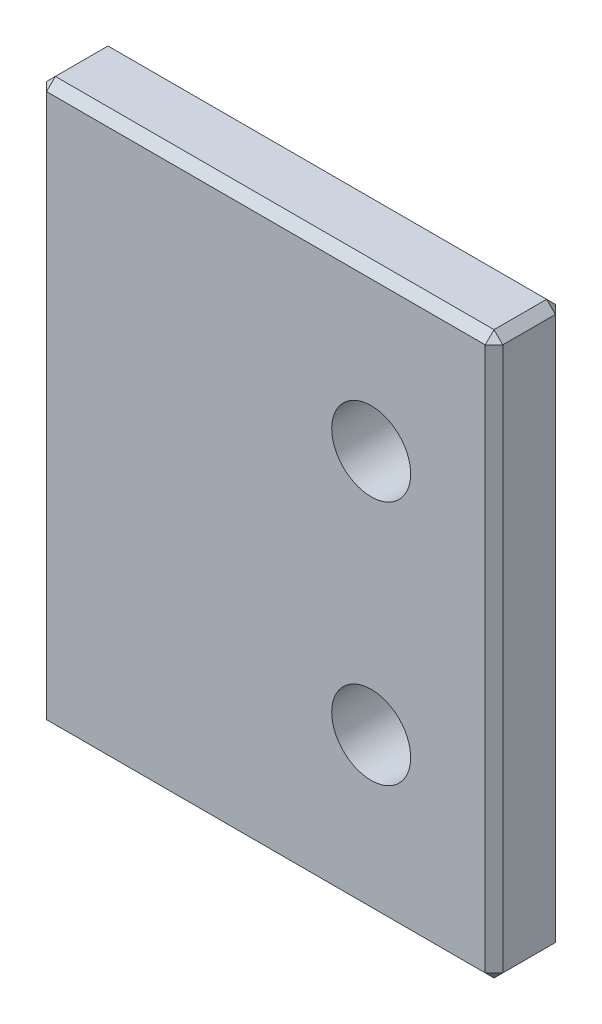
ISO-10303-21;
HEADER;
FILE_DESCRIPTION(('STEP AP214'),'2;1');
FILE_NAME('part.step','',(''),(''),'','','');
FILE_SCHEMA(('AUTOMOTIVE_DESIGN { 1 0 10303 214 1 1 1 1 }'));
ENDSEC;
DATA;
#1=APPLICATION_CONTEXT('core data for automotive mechanical design processes');
#2=APPLICATION_PROTOCOL_DEFINITION('international standard','automotive_design',2000,#1);
#3=PRODUCT_CONTEXT('',#1,'mechanical');
#4=PRODUCT('Part','Part','',(#3));
#5=PRODUCT_RELATED_PRODUCT_CATEGORY('part','',(#4));
#6=PRODUCT_DEFINITION_FORMATION('','',#4);
#7=PRODUCT_DEFINITION_CONTEXT('part definition',#1,'design');
#8=PRODUCT_DEFINITION('design','',#6,#7);
#9=PRODUCT_DEFINITION_SHAPE('','',#8);
#10=(LENGTH_UNIT() NAMED_UNIT(*) SI_UNIT(.MILLI.,.METRE.));
#11=(NAMED_UNIT(*) PLANE_ANGLE_UNIT() SI_UNIT($,.RADIAN.));
#12=(NAMED_UNIT(*) SI_UNIT($,.STERADIAN.) SOLID_ANGLE_UNIT());
#13=UNCERTAINTY_MEASURE_WITH_UNIT(LENGTH_MEASURE(1.E-05),#10,'distance_accuracy_value','');
#14=(GEOMETRIC_REPRESENTATION_CONTEXT(3) GLOBAL_UNCERTAINTY_ASSIGNED_CONTEXT((#13)) GLOBAL_UNIT_ASSIGNED_CONTEXT((#10,
#11,#12)) REPRESENTATION_CONTEXT('',''));
#15=CARTESIAN_POINT('',(0.,0.,0.));
#16=DIRECTION('',(0.,0.,1.));
#17=DIRECTION('',(1.,0.,0.));
#18=AXIS2_PLACEMENT_3D('',#15,#16,#17);
#19=CARTESIAN_POINT('',(0.,0.,4.));
#20=DIRECTION('',(1.,0.,0.));
#21=DIRECTION('',(0.,1.,0.));
#22=AXIS2_PLACEMENT_3D('',#19,#20,#21);
#23=PLANE('',#22);
#24=DIRECTION('',(0.,-1.,0.));
#25=VECTOR('',#24,1.);
#26=CARTESIAN_POINT('',(0.,0.,0.499999999999997));
#27=LINE('',#26,#25);
#28=CARTESIAN_POINT('',(0.,31.5,0.499999999999997));
#29=VERTEX_POINT('',#28);
#30=CARTESIAN_POINT('',(0.,0.5,0.499999999999997));
#31=VERTEX_POINT('',#30);
#32=EDGE_CURVE('E171',#29,#31,#27,.T.);
#33=ORIENTED_EDGE('',*,*,#32,.T.);
#34=DIRECTION('',(0.,0.,1.));
#35=VECTOR('',#34,1.);
#36=CARTESIAN_POINT('',(0.,0.5,4.));
#37=LINE('',#36,#35);
#38=CARTESIAN_POINT('',(0.,0.5,3.5));
#39=VERTEX_POINT('',#38);
#40=EDGE_CURVE('E176',#31,#39,#37,.T.);
#41=ORIENTED_EDGE('',*,*,#40,.T.);
#42=DIRECTION('',(0.,1.,0.));
#43=VECTOR('',#42,1.);
#44=CARTESIAN_POINT('',(0.,0.,3.5));
#45=LINE('',#44,#43);
#46=CARTESIAN_POINT('',(0.,31.5,3.5));
#47=VERTEX_POINT('',#46);
#48=EDGE_CURVE('E173',#39,#47,#45,.T.);
#49=ORIENTED_EDGE('',*,*,#48,.T.);
#50=DIRECTION('',(0.,0.,-1.));
#51=VECTOR('',#50,1.);
#52=CARTESIAN_POINT('',(0.,31.5,4.));
#53=LINE('',#52,#51);
#54=EDGE_CURVE('E169',#47,#29,#53,.T.);
#55=ORIENTED_EDGE('',*,*,#54,.T.);
#56=EDGE_LOOP('',(#33,#41,#49,#55));
#57=FACE_BOUND('',#56,.T.);
#58=ADVANCED_FACE('F36',(#57),#23,.F.);
#59=CARTESIAN_POINT('',(0.,0.,4.));
#60=DIRECTION('',(0.,1.,0.));
#61=DIRECTION('',(0.,0.,1.));
#62=AXIS2_PLACEMENT_3D('',#59,#60,#61);
#63=PLANE('',#62);
#64=DIRECTION('',(-1.,0.,0.));
#65=VECTOR('',#64,1.);
#66=CARTESIAN_POINT('',(0.,0.,3.5));
#67=LINE('',#66,#65);
#68=CARTESIAN_POINT('',(25.5,0.,3.5));
#69=VERTEX_POINT('',#68);
#70=CARTESIAN_POINT('',(0.499999999999997,0.,3.5));
#71=VERTEX_POINT('',#70);
#72=EDGE_CURVE('E191',#69,#71,#67,.T.);
#73=ORIENTED_EDGE('',*,*,#72,.T.);
#74=DIRECTION('',(0.,0.,-1.));
#75=VECTOR('',#74,1.);
#76=CARTESIAN_POINT('',(0.499999999999997,0.,4.));
#77=LINE('',#76,#75);
#78=CARTESIAN_POINT('',(0.499999999999997,0.,0.499999999999997));
#79=VERTEX_POINT('',#78);
#80=EDGE_CURVE('E193',#71,#79,#77,.T.);
#81=ORIENTED_EDGE('',*,*,#80,.T.);
#82=DIRECTION('',(1.,0.,0.));
#83=VECTOR('',#82,1.);
#84=CARTESIAN_POINT('',(26.,0.,0.499999999999997));
#85=LINE('',#84,#83);
#86=CARTESIAN_POINT('',(25.5,0.,0.499999999999997));
#87=VERTEX_POINT('',#86);
#88=EDGE_CURVE('E189',#79,#87,#85,.T.);
#89=ORIENTED_EDGE('',*,*,#88,.T.);
#90=DIRECTION('',(0.,0.,1.));
#91=VECTOR('',#90,1.);
#92=CARTESIAN_POINT('',(25.5,0.,4.));
#93=LINE('',#92,#91);
#94=EDGE_CURVE('E187',#87,#69,#93,.T.);
#95=ORIENTED_EDGE('',*,*,#94,.T.);
#96=EDGE_LOOP('',(#73,#81,#89,#95));
#97=FACE_BOUND('',#96,.T.);
#98=ADVANCED_FACE('F283',(#97),#63,.F.);
#99=CARTESIAN_POINT('',(26.,0.,4.));
#100=DIRECTION('',(-1.,0.,0.));
#101=DIRECTION('',(0.,-1.,0.));
#102=AXIS2_PLACEMENT_3D('',#99,#100,#101);
#103=PLANE('',#102);
#104=DIRECTION('',(0.,-1.,0.));
#105=VECTOR('',#104,1.);
#106=CARTESIAN_POINT('',(26.,0.,3.5));
#107=LINE('',#106,#105);
#108=CARTESIAN_POINT('',(26.,31.5,3.5));
#109=VERTEX_POINT('',#108);
#110=CARTESIAN_POINT('',(26.,0.499999999999997,3.5));
#111=VERTEX_POINT('',#110);
#112=EDGE_CURVE('E141',#109,#111,#107,.T.);
#113=ORIENTED_EDGE('',*,*,#112,.T.);
#114=DIRECTION('',(0.,0.,-1.));
#115=VECTOR('',#114,1.);
#116=CARTESIAN_POINT('',(26.,0.499999999999997,4.));
#117=LINE('',#116,#115);
#118=CARTESIAN_POINT('',(26.,0.499999999999997,0.499999999999997));
#119=VERTEX_POINT('',#118);
#120=EDGE_CURVE('E201',#111,#119,#117,.T.);
#121=ORIENTED_EDGE('',*,*,#120,.T.);
#122=DIRECTION('',(0.,1.,0.));
#123=VECTOR('',#122,1.);
#124=CARTESIAN_POINT('',(26.,32.,0.499999999999997));
#125=LINE('',#124,#123);
#126=CARTESIAN_POINT('',(26.,31.5,0.499999999999997));
#127=VERTEX_POINT('',#126);
#128=EDGE_CURVE('E198',#119,#127,#125,.T.);
#129=ORIENTED_EDGE('',*,*,#128,.T.);
#130=DIRECTION('',(0.,0.,1.));
#131=VECTOR('',#130,1.);
#132=CARTESIAN_POINT('',(26.,31.5,4.));
#133=LINE('',#132,#131);
#134=EDGE_CURVE('E196',#127,#109,#133,.T.);
#135=ORIENTED_EDGE('',*,*,#134,.T.);
#136=EDGE_LOOP('',(#113,#121,#129,#135));
#137=FACE_BOUND('',#136,.T.);
#138=ADVANCED_FACE('F270',(#137),#103,.F.);
#139=CARTESIAN_POINT('',(0.,32.,4.));
#140=DIRECTION('',(0.,-1.,0.));
#141=DIRECTION('',(0.,0.,-1.));
#142=AXIS2_PLACEMENT_3D('',#139,#140,#141);
#143=PLANE('',#142);
#144=DIRECTION('',(1.,0.,0.));
#145=VECTOR('',#144,1.);
#146=CARTESIAN_POINT('',(0.,32.,3.5));
#147=LINE('',#146,#145);
#148=CARTESIAN_POINT('',(0.499999999999987,32.,3.5));
#149=VERTEX_POINT('',#148);
#150=CARTESIAN_POINT('',(25.5,32.,3.5));
#151=VERTEX_POINT('',#150);
#152=EDGE_CURVE('E45',#149,#151,#147,.T.);
#153=ORIENTED_EDGE('',*,*,#152,.T.);
#154=DIRECTION('',(0.,0.,-1.));
#155=VECTOR('',#154,1.);
#156=CARTESIAN_POINT('',(25.5,32.,4.));
#157=LINE('',#156,#155);
#158=CARTESIAN_POINT('',(25.5,32.,0.499999999999997));
#159=VERTEX_POINT('',#158);
#160=EDGE_CURVE('E11',#151,#159,#157,.T.);
#161=ORIENTED_EDGE('',*,*,#160,.T.);
#162=DIRECTION('',(-1.,0.,0.));
#163=VECTOR('',#162,1.);
#164=CARTESIAN_POINT('',(0.,32.,0.499999999999997));
#165=LINE('',#164,#163);
#166=CARTESIAN_POINT('',(0.499999999999987,32.,0.499999999999997));
#167=VERTEX_POINT('',#166);
#168=EDGE_CURVE('E204',#159,#167,#165,.T.);
#169=ORIENTED_EDGE('',*,*,#168,.T.);
#170=DIRECTION('',(0.,0.,1.));
#171=VECTOR('',#170,1.);
#172=CARTESIAN_POINT('',(0.499999999999987,32.,4.));
#173=LINE('',#172,#171);
#174=EDGE_CURVE('E56',#167,#149,#173,.T.);
#175=ORIENTED_EDGE('',*,*,#174,.T.);
#176=EDGE_LOOP('',(#153,#161,#169,#175));
#177=FACE_BOUND('',#176,.T.);
#178=ADVANCED_FACE('F316',(#177),#143,.F.);
#179=CARTESIAN_POINT('',(0.,32.,4.));
#180=DIRECTION('',(0.,0.,-1.));
#181=DIRECTION('',(-1.,0.,0.));
#182=AXIS2_PLACEMENT_3D('',#179,#180,#181);
#183=PLANE('',#182);
#184=CARTESIAN_POINT('',(19.,23.0000000000001,4.));
#185=DIRECTION('',(0.,0.,-1.));
#186=DIRECTION('',(-1.,0.,0.));
#187=AXIS2_PLACEMENT_3D('',#184,#185,#186);
#188=CIRCLE('',#187,2.25000000000012);
#189=CARTESIAN_POINT('',(16.7499999999998,23.0000000000001,4.));
#190=VERTEX_POINT('',#189);
#191=EDGE_CURVE('E404',#190,#190,#188,.T.);
#192=ORIENTED_EDGE('',*,*,#191,.T.);
#193=EDGE_LOOP('',(#192));
#194=FACE_BOUND('',#193,.T.);
#195=CARTESIAN_POINT('',(19.,9.0000000000001,4.));
#196=DIRECTION('',(0.,0.,-1.));
#197=DIRECTION('',(-1.,0.,0.));
#198=AXIS2_PLACEMENT_3D('',#195,#196,#197);
#199=CIRCLE('',#198,2.25000000000011);
#200=CARTESIAN_POINT('',(16.7499999999998,9.0000000000001,4.));
#201=VERTEX_POINT('',#200);
#202=EDGE_CURVE('E211',#201,#201,#199,.T.);
#203=ORIENTED_EDGE('',*,*,#202,.T.);
#204=EDGE_LOOP('',(#203));
#205=FACE_BOUND('',#204,.T.);
#206=DIRECTION('',(-1.,0.,0.));
#207=VECTOR('',#206,1.);
#208=CARTESIAN_POINT('',(0.,31.5,4.));
#209=LINE('',#208,#207);
#210=CARTESIAN_POINT('',(25.5,31.5,4.));
#211=VERTEX_POINT('',#210);
#212=CARTESIAN_POINT('',(0.499999999999987,31.5,4.));
#213=VERTEX_POINT('',#212);
#214=EDGE_CURVE('E128',#211,#213,#209,.T.);
#215=ORIENTED_EDGE('',*,*,#214,.T.);
#216=DIRECTION('',(0.,-1.,0.));
#217=VECTOR('',#216,1.);
#218=CARTESIAN_POINT('',(0.499999999999987,32.,4.));
#219=LINE('',#218,#217);
#220=CARTESIAN_POINT('',(0.499999999999997,0.5,4.));
#221=VERTEX_POINT('',#220);
#222=EDGE_CURVE('E167',#213,#221,#219,.T.);
#223=ORIENTED_EDGE('',*,*,#222,.T.);
#224=DIRECTION('',(1.,0.,0.));
#225=VECTOR('',#224,1.);
#226=CARTESIAN_POINT('',(0.,0.5,4.));
#227=LINE('',#226,#225);
#228=CARTESIAN_POINT('',(25.5,0.5,4.));
#229=VERTEX_POINT('',#228);
#230=EDGE_CURVE('E131',#221,#229,#227,.T.);
#231=ORIENTED_EDGE('',*,*,#230,.T.);
#232=DIRECTION('',(0.,1.,0.));
#233=VECTOR('',#232,1.);
#234=CARTESIAN_POINT('',(25.5,32.,4.));
#235=LINE('',#234,#233);
#236=EDGE_CURVE('E123',#229,#211,#235,.T.);
#237=ORIENTED_EDGE('',*,*,#236,.T.);
#238=EDGE_LOOP('',(#215,#223,#231,#237));
#239=FACE_BOUND('',#238,.T.);
#240=ADVANCED_FACE('F125',(#194,#205,#239),#183,.F.);
#241=CARTESIAN_POINT('',(0.,32.,0.));
#242=DIRECTION('',(0.,0.,-1.));
#243=DIRECTION('',(-1.,0.,0.));
#244=AXIS2_PLACEMENT_3D('',#241,#242,#243);
#245=PLANE('',#244);
#246=CARTESIAN_POINT('',(19.,23.0000000000001,0.));
#247=DIRECTION('',(0.,0.,-1.));
#248=DIRECTION('',(-1.,0.,0.));
#249=AXIS2_PLACEMENT_3D('',#246,#247,#248);
#250=CIRCLE('',#249,2.25000000000012);
#251=CARTESIAN_POINT('',(16.7499999999998,23.0000000000001,0.));
#252=VERTEX_POINT('',#251);
#253=EDGE_CURVE('E406',#252,#252,#250,.T.);
#254=ORIENTED_EDGE('',*,*,#253,.F.);
#255=EDGE_LOOP('',(#254));
#256=FACE_BOUND('',#255,.T.);
#257=CARTESIAN_POINT('',(19.,9.0000000000001,0.));
#258=DIRECTION('',(0.,0.,-1.));
#259=DIRECTION('',(-1.,0.,0.));
#260=AXIS2_PLACEMENT_3D('',#257,#258,#259);
#261=CIRCLE('',#260,2.25000000000011);
#262=CARTESIAN_POINT('',(16.7499999999998,9.0000000000001,0.));
#263=VERTEX_POINT('',#262);
#264=EDGE_CURVE('E163',#263,#263,#261,.T.);
#265=ORIENTED_EDGE('',*,*,#264,.F.);
#266=EDGE_LOOP('',(#265));
#267=FACE_BOUND('',#266,.T.);
#268=DIRECTION('',(-1.,0.,0.));
#269=VECTOR('',#268,1.);
#270=CARTESIAN_POINT('',(0.,0.5,0.));
#271=LINE('',#270,#269);
#272=CARTESIAN_POINT('',(25.5,0.5,0.));
#273=VERTEX_POINT('',#272);
#274=CARTESIAN_POINT('',(0.5,0.5,0.));
#275=VERTEX_POINT('',#274);
#276=EDGE_CURVE('E182',#273,#275,#271,.T.);
#277=ORIENTED_EDGE('',*,*,#276,.T.);
#278=DIRECTION('',(0.,1.,0.));
#279=VECTOR('',#278,1.);
#280=CARTESIAN_POINT('',(0.49999999999999,32.,0.));
#281=LINE('',#280,#279);
#282=CARTESIAN_POINT('',(0.49999999999999,31.5,0.));
#283=VERTEX_POINT('',#282);
#284=EDGE_CURVE('E184',#275,#283,#281,.T.);
#285=ORIENTED_EDGE('',*,*,#284,.T.);
#286=DIRECTION('',(1.,0.,0.));
#287=VECTOR('',#286,1.);
#288=CARTESIAN_POINT('',(26.,31.5,0.));
#289=LINE('',#288,#287);
#290=CARTESIAN_POINT('',(25.5,31.5,0.));
#291=VERTEX_POINT('',#290);
#292=EDGE_CURVE('E178',#283,#291,#289,.T.);
#293=ORIENTED_EDGE('',*,*,#292,.T.);
#294=DIRECTION('',(0.,-1.,0.));
#295=VECTOR('',#294,1.);
#296=CARTESIAN_POINT('',(25.5,0.,0.));
#297=LINE('',#296,#295);
#298=EDGE_CURVE('E180',#291,#273,#297,.T.);
#299=ORIENTED_EDGE('',*,*,#298,.T.);
#300=EDGE_LOOP('',(#277,#285,#293,#299));
#301=FACE_BOUND('',#300,.T.);
#302=ADVANCED_FACE('F299',(#256,#267,#301),#245,.T.);
#303=CARTESIAN_POINT('',(26.,0.,0.499999999999997));
#304=DIRECTION('',(0.707106781186547,0.,-0.707106781186547));
#305=DIRECTION('',(-0.707106781186548,0.,-0.707106781186548));
#306=AXIS2_PLACEMENT_3D('',#303,#304,#305);
#307=PLANE('',#306);
#308=DIRECTION('',(-0.707106781186548,0.,-0.707106781186548));
#309=VECTOR('',#308,1.);
#310=CARTESIAN_POINT('',(26.,31.5,0.499999999999997));
#311=LINE('',#310,#309);
#312=EDGE_CURVE('E40',#127,#291,#311,.T.);
#313=ORIENTED_EDGE('',*,*,#312,.F.);
#314=ORIENTED_EDGE('',*,*,#128,.F.);
#315=DIRECTION('',(0.707106781186547,0.,0.707106781186547));
#316=VECTOR('',#315,1.);
#317=CARTESIAN_POINT('',(25.75,0.499999999999999,0.249999999999999));
#318=LINE('',#317,#316);
#319=EDGE_CURVE('E161',#273,#119,#318,.T.);
#320=ORIENTED_EDGE('',*,*,#319,.F.);
#321=ORIENTED_EDGE('',*,*,#298,.F.);
#322=EDGE_LOOP('',(#313,#314,#320,#321));
#323=FACE_BOUND('',#322,.T.);
#324=ADVANCED_FACE('F38',(#323),#307,.T.);
#325=CARTESIAN_POINT('',(26.,31.5,0.499999999999997));
#326=DIRECTION('',(0.577350269189627,0.577350269189623,-0.577350269189627));
#327=DIRECTION('',(-0.707106781186547,0.,-0.707106781186547));
#328=AXIS2_PLACEMENT_3D('',#325,#326,#327);
#329=PLANE('',#328);
#330=DIRECTION('',(-0.707106781186545,0.70710678118655,0.));
#331=VECTOR('',#330,1.);
#332=CARTESIAN_POINT('',(26.,31.5,0.499999999999997));
#333=LINE('',#332,#331);
#334=EDGE_CURVE('E250',#127,#159,#333,.T.);
#335=ORIENTED_EDGE('',*,*,#334,.F.);
#336=ORIENTED_EDGE('',*,*,#312,.T.);
#337=DIRECTION('',(0.,0.70710678118655,0.707106781186545));
#338=VECTOR('',#337,1.);
#339=CARTESIAN_POINT('',(25.5,31.75,0.249999999999997));
#340=LINE('',#339,#338);
#341=EDGE_CURVE('E253',#159,#291,#340,.F.);
#342=ORIENTED_EDGE('',*,*,#341,.F.);
#343=EDGE_LOOP('',(#335,#336,#342));
#344=FACE_BOUND('',#343,.T.);
#345=ADVANCED_FACE('F312',(#344),#329,.T.);
#346=CARTESIAN_POINT('',(25.5,0.,0.499999999999997));
#347=DIRECTION('',(0.577350269189623,-0.577350269189627,-0.577350269189627));
#348=DIRECTION('',(0.,0.707106781186547,-0.707106781186547));
#349=AXIS2_PLACEMENT_3D('',#346,#347,#348);
#350=PLANE('',#349);
#351=DIRECTION('',(0.,0.70710678118655,-0.707106781186545));
#352=VECTOR('',#351,1.);
#353=CARTESIAN_POINT('',(25.5,0.,0.499999999999997));
#354=LINE('',#353,#352);
#355=EDGE_CURVE('E245',#273,#87,#354,.F.);
#356=ORIENTED_EDGE('',*,*,#355,.F.);
#357=ORIENTED_EDGE('',*,*,#319,.T.);
#358=DIRECTION('',(0.70710678118655,0.707106781186545,0.));
#359=VECTOR('',#358,1.);
#360=CARTESIAN_POINT('',(25.5,0.,0.499999999999997));
#361=LINE('',#360,#359);
#362=EDGE_CURVE('E248',#87,#119,#361,.T.);
#363=ORIENTED_EDGE('',*,*,#362,.F.);
#364=EDGE_LOOP('',(#356,#357,#363));
#365=FACE_BOUND('',#364,.T.);
#366=ADVANCED_FACE('F261',(#365),#350,.T.);
#367=CARTESIAN_POINT('',(0.,32.,0.499999999999997));
#368=DIRECTION('',(0.,0.707106781186545,-0.70710678118655));
#369=DIRECTION('',(0.,0.70710678118655,0.707106781186545));
#370=AXIS2_PLACEMENT_3D('',#367,#368,#369);
#371=PLANE('',#370);
#372=ORIENTED_EDGE('',*,*,#341,.T.);
#373=ORIENTED_EDGE('',*,*,#292,.F.);
#374=DIRECTION('',(0.,-0.70710678118655,-0.707106781186545));
#375=VECTOR('',#374,1.);
#376=CARTESIAN_POINT('',(0.49999999999999,31.5,0.));
#377=LINE('',#376,#375);
#378=EDGE_CURVE('E240',#167,#283,#377,.T.);
#379=ORIENTED_EDGE('',*,*,#378,.F.);
#380=ORIENTED_EDGE('',*,*,#168,.F.);
#381=EDGE_LOOP('',(#372,#373,#379,#380));
#382=FACE_BOUND('',#381,.T.);
#383=ADVANCED_FACE('F309',(#382),#371,.T.);
#384=CARTESIAN_POINT('',(25.5,32.,4.));
#385=DIRECTION('',(-0.70710678118655,-0.707106781186545,0.));
#386=DIRECTION('',(0.707106781186545,-0.70710678118655,0.));
#387=AXIS2_PLACEMENT_3D('',#384,#385,#386);
#388=PLANE('',#387);
#389=ORIENTED_EDGE('',*,*,#334,.T.);
#390=ORIENTED_EDGE('',*,*,#160,.F.);
#391=DIRECTION('',(0.707106781186545,-0.70710678118655,0.));
#392=VECTOR('',#391,1.);
#393=CARTESIAN_POINT('',(25.75,31.75,3.5));
#394=LINE('',#393,#392);
#395=EDGE_CURVE('E145',#109,#151,#394,.F.);
#396=ORIENTED_EDGE('',*,*,#395,.F.);
#397=ORIENTED_EDGE('',*,*,#134,.F.);
#398=EDGE_LOOP('',(#389,#390,#396,#397));
#399=FACE_BOUND('',#398,.T.);
#400=ADVANCED_FACE('F315',(#399),#388,.F.);
#401=CARTESIAN_POINT('',(25.5,32.,4.));
#402=DIRECTION('',(-0.70710678118655,0.,-0.707106781186545));
#403=DIRECTION('',(-0.707106781186545,0.,0.70710678118655));
#404=AXIS2_PLACEMENT_3D('',#401,#402,#403);
#405=PLANE('',#404);
#406=DIRECTION('',(0.707106781186545,0.,-0.70710678118655));
#407=VECTOR('',#406,1.);
#408=CARTESIAN_POINT('',(25.5,0.5,4.));
#409=LINE('',#408,#407);
#410=EDGE_CURVE('E146',#111,#229,#409,.F.);
#411=ORIENTED_EDGE('',*,*,#410,.F.);
#412=ORIENTED_EDGE('',*,*,#112,.F.);
#413=DIRECTION('',(-0.707106781186545,0.,0.70710678118655));
#414=VECTOR('',#413,1.);
#415=CARTESIAN_POINT('',(25.5,31.5,4.));
#416=LINE('',#415,#414);
#417=EDGE_CURVE('E138',#211,#109,#416,.F.);
#418=ORIENTED_EDGE('',*,*,#417,.F.);
#419=ORIENTED_EDGE('',*,*,#236,.F.);
#420=EDGE_LOOP('',(#411,#412,#418,#419));
#421=FACE_BOUND('',#420,.T.);
#422=ADVANCED_FACE('F140',(#421),#405,.F.);
#423=CARTESIAN_POINT('',(26.,0.499999999999997,4.));
#424=DIRECTION('',(-0.707106781186545,0.70710678118655,0.));
#425=DIRECTION('',(-0.70710678118655,-0.707106781186545,0.));
#426=AXIS2_PLACEMENT_3D('',#423,#424,#425);
#427=PLANE('',#426);
#428=ORIENTED_EDGE('',*,*,#362,.T.);
#429=ORIENTED_EDGE('',*,*,#120,.F.);
#430=DIRECTION('',(-0.70710678118655,-0.707106781186545,0.));
#431=VECTOR('',#430,1.);
#432=CARTESIAN_POINT('',(25.75,0.25,3.5));
#433=LINE('',#432,#431);
#434=EDGE_CURVE('E235',#69,#111,#433,.F.);
#435=ORIENTED_EDGE('',*,*,#434,.F.);
#436=ORIENTED_EDGE('',*,*,#94,.F.);
#437=EDGE_LOOP('',(#428,#429,#435,#436));
#438=FACE_BOUND('',#437,.T.);
#439=ADVANCED_FACE('F273',(#438),#427,.F.);
#440=CARTESIAN_POINT('',(0.,0.,0.499999999999997));
#441=DIRECTION('',(0.,-0.707106781186545,-0.70710678118655));
#442=DIRECTION('',(0.,0.70710678118655,-0.707106781186545));
#443=AXIS2_PLACEMENT_3D('',#440,#441,#442);
#444=PLANE('',#443);
#445=ORIENTED_EDGE('',*,*,#355,.T.);
#446=ORIENTED_EDGE('',*,*,#88,.F.);
#447=DIRECTION('',(0.,-0.70710678118655,0.707106781186545));
#448=VECTOR('',#447,1.);
#449=CARTESIAN_POINT('',(0.499999999999998,0.25,0.249999999999999));
#450=LINE('',#449,#448);
#451=EDGE_CURVE('E232',#275,#79,#450,.T.);
#452=ORIENTED_EDGE('',*,*,#451,.F.);
#453=ORIENTED_EDGE('',*,*,#276,.F.);
#454=EDGE_LOOP('',(#445,#446,#452,#453));
#455=FACE_BOUND('',#454,.T.);
#456=ADVANCED_FACE('F296',(#455),#444,.T.);
#457=CARTESIAN_POINT('',(0.,0.,0.499999999999997));
#458=DIRECTION('',(-0.707106781186545,0.,-0.70710678118655));
#459=DIRECTION('',(-0.70710678118655,0.,0.707106781186545));
#460=AXIS2_PLACEMENT_3D('',#457,#458,#459);
#461=PLANE('',#460);
#462=DIRECTION('',(-0.70710678118655,0.,0.707106781186545));
#463=VECTOR('',#462,1.);
#464=CARTESIAN_POINT('',(0.49999999999999,31.5,0.));
#465=LINE('',#464,#463);
#466=EDGE_CURVE('E242',#283,#29,#465,.T.);
#467=ORIENTED_EDGE('',*,*,#466,.F.);
#468=ORIENTED_EDGE('',*,*,#284,.F.);
#469=DIRECTION('',(0.70710678118655,0.,-0.707106781186545));
#470=VECTOR('',#469,1.);
#471=CARTESIAN_POINT('',(0.,0.5,0.499999999999997));
#472=LINE('',#471,#470);
#473=EDGE_CURVE('E229',#31,#275,#472,.T.);
#474=ORIENTED_EDGE('',*,*,#473,.F.);
#475=ORIENTED_EDGE('',*,*,#32,.F.);
#476=EDGE_LOOP('',(#467,#468,#474,#475));
#477=FACE_BOUND('',#476,.T.);
#478=ADVANCED_FACE('F302',(#477),#461,.T.);
#479=CARTESIAN_POINT('',(0.49999999999999,31.5,0.));
#480=DIRECTION('',(-0.577350269189626,0.577350269189622,-0.57735026918963));
#481=DIRECTION('',(-0.70710678118655,0.,0.707106781186545));
#482=AXIS2_PLACEMENT_3D('',#479,#480,#481);
#483=PLANE('',#482);
#484=ORIENTED_EDGE('',*,*,#378,.T.);
#485=ORIENTED_EDGE('',*,*,#466,.T.);
#486=DIRECTION('',(-0.707106781186545,-0.70710678118655,0.));
#487=VECTOR('',#486,1.);
#488=CARTESIAN_POINT('',(0.249999999999988,31.75,0.499999999999997));
#489=LINE('',#488,#487);
#490=EDGE_CURVE('E152',#167,#29,#489,.T.);
#491=ORIENTED_EDGE('',*,*,#490,.F.);
#492=EDGE_LOOP('',(#484,#485,#491));
#493=FACE_BOUND('',#492,.T.);
#494=ADVANCED_FACE('F364',(#493),#483,.T.);
#495=CARTESIAN_POINT('',(25.5,31.5,4.));
#496=DIRECTION('',(0.57735026918963,0.577350269189622,0.577350269189626));
#497=DIRECTION('',(0.707106781186545,0.,-0.70710678118655));
#498=AXIS2_PLACEMENT_3D('',#495,#496,#497);
#499=PLANE('',#498);
#500=ORIENTED_EDGE('',*,*,#417,.T.);
#501=ORIENTED_EDGE('',*,*,#395,.T.);
#502=DIRECTION('',(0.,0.70710678118655,-0.707106781186545));
#503=VECTOR('',#502,1.);
#504=CARTESIAN_POINT('',(25.5,31.5,4.));
#505=LINE('',#504,#503);
#506=EDGE_CURVE('E149',#211,#151,#505,.T.);
#507=ORIENTED_EDGE('',*,*,#506,.F.);
#508=EDGE_LOOP('',(#500,#501,#507));
#509=FACE_BOUND('',#508,.T.);
#510=ADVANCED_FACE('F150',(#509),#499,.T.);
#511=CARTESIAN_POINT('',(25.5,0.5,4.));
#512=DIRECTION('',(0.577350269189625,-0.577350269189628,0.577350269189624));
#513=DIRECTION('',(0.70710678118655,0.707106781186545,0.));
#514=AXIS2_PLACEMENT_3D('',#511,#512,#513);
#515=PLANE('',#514);
#516=ORIENTED_EDGE('',*,*,#434,.T.);
#517=ORIENTED_EDGE('',*,*,#410,.T.);
#518=DIRECTION('',(0.,0.707106781186548,0.707106781186548));
#519=VECTOR('',#518,1.);
#520=CARTESIAN_POINT('',(25.5,0.5,4.));
#521=LINE('',#520,#519);
#522=EDGE_CURVE('E153',#69,#229,#521,.T.);
#523=ORIENTED_EDGE('',*,*,#522,.F.);
#524=EDGE_LOOP('',(#516,#517,#523));
#525=FACE_BOUND('',#524,.T.);
#526=ADVANCED_FACE('F276',(#525),#515,.T.);
#527=CARTESIAN_POINT('',(0.,0.5,0.499999999999997));
#528=DIRECTION('',(-0.577350269189626,-0.577350269189622,-0.57735026918963));
#529=DIRECTION('',(-0.70710678118655,0.,0.707106781186545));
#530=AXIS2_PLACEMENT_3D('',#527,#528,#529);
#531=PLANE('',#530);
#532=ORIENTED_EDGE('',*,*,#473,.T.);
#533=ORIENTED_EDGE('',*,*,#451,.T.);
#534=DIRECTION('',(0.707106781186545,-0.70710678118655,0.));
#535=VECTOR('',#534,1.);
#536=CARTESIAN_POINT('',(0.,0.5,0.499999999999997));
#537=LINE('',#536,#535);
#538=EDGE_CURVE('E223',#31,#79,#537,.T.);
#539=ORIENTED_EDGE('',*,*,#538,.F.);
#540=EDGE_LOOP('',(#532,#533,#539));
#541=FACE_BOUND('',#540,.T.);
#542=ADVANCED_FACE('F293',(#541),#531,.T.);
#543=CARTESIAN_POINT('',(0.,31.5,4.));
#544=DIRECTION('',(0.70710678118655,-0.707106781186545,0.));
#545=DIRECTION('',(0.707106781186545,0.70710678118655,0.));
#546=AXIS2_PLACEMENT_3D('',#543,#544,#545);
#547=PLANE('',#546);
#548=ORIENTED_EDGE('',*,*,#490,.T.);
#549=ORIENTED_EDGE('',*,*,#54,.F.);
#550=DIRECTION('',(0.707106781186545,0.70710678118655,0.));
#551=VECTOR('',#550,1.);
#552=CARTESIAN_POINT('',(0.,31.5,3.5));
#553=LINE('',#552,#551);
#554=EDGE_CURVE('E220',#149,#47,#553,.F.);
#555=ORIENTED_EDGE('',*,*,#554,.F.);
#556=ORIENTED_EDGE('',*,*,#174,.F.);
#557=EDGE_LOOP('',(#548,#549,#555,#556));
#558=FACE_BOUND('',#557,.T.);
#559=ADVANCED_FACE('F354',(#558),#547,.F.);
#560=CARTESIAN_POINT('',(0.,31.5,4.));
#561=DIRECTION('',(0.,-0.707106781186545,-0.70710678118655));
#562=DIRECTION('',(0.,0.70710678118655,-0.707106781186545));
#563=AXIS2_PLACEMENT_3D('',#560,#561,#562);
#564=PLANE('',#563);
#565=ORIENTED_EDGE('',*,*,#506,.T.);
#566=ORIENTED_EDGE('',*,*,#152,.F.);
#567=DIRECTION('',(0.,-0.70710678118655,0.707106781186545));
#568=VECTOR('',#567,1.);
#569=CARTESIAN_POINT('',(0.499999999999987,31.75,3.75));
#570=LINE('',#569,#568);
#571=EDGE_CURVE('E157',#213,#149,#570,.F.);
#572=ORIENTED_EDGE('',*,*,#571,.F.);
#573=ORIENTED_EDGE('',*,*,#214,.F.);
#574=EDGE_LOOP('',(#565,#566,#572,#573));
#575=FACE_BOUND('',#574,.T.);
#576=ADVANCED_FACE('F155',(#575),#564,.F.);
#577=CARTESIAN_POINT('',(0.,0.5,4.));
#578=DIRECTION('',(0.,0.707106781186547,-0.707106781186547));
#579=DIRECTION('',(0.,0.707106781186548,0.707106781186548));
#580=AXIS2_PLACEMENT_3D('',#577,#578,#579);
#581=PLANE('',#580);
#582=ORIENTED_EDGE('',*,*,#522,.T.);
#583=ORIENTED_EDGE('',*,*,#230,.F.);
#584=DIRECTION('',(0.,-0.707106781186547,-0.707106781186547));
#585=VECTOR('',#584,1.);
#586=CARTESIAN_POINT('',(0.499999999999997,0.5,4.));
#587=LINE('',#586,#585);
#588=EDGE_CURVE('E216',#71,#221,#587,.F.);
#589=ORIENTED_EDGE('',*,*,#588,.F.);
#590=ORIENTED_EDGE('',*,*,#72,.F.);
#591=EDGE_LOOP('',(#582,#583,#589,#590));
#592=FACE_BOUND('',#591,.T.);
#593=ADVANCED_FACE('F280',(#592),#581,.F.);
#594=CARTESIAN_POINT('',(0.499999999999997,0.,4.));
#595=DIRECTION('',(0.70710678118655,0.707106781186545,0.));
#596=DIRECTION('',(-0.707106781186545,0.70710678118655,0.));
#597=AXIS2_PLACEMENT_3D('',#594,#595,#596);
#598=PLANE('',#597);
#599=ORIENTED_EDGE('',*,*,#538,.T.);
#600=ORIENTED_EDGE('',*,*,#80,.F.);
#601=DIRECTION('',(-0.707106781186545,0.70710678118655,0.));
#602=VECTOR('',#601,1.);
#603=CARTESIAN_POINT('',(0.249999999999997,0.250000000000002,3.5));
#604=LINE('',#603,#602);
#605=EDGE_CURVE('E213',#39,#71,#604,.F.);
#606=ORIENTED_EDGE('',*,*,#605,.F.);
#607=ORIENTED_EDGE('',*,*,#40,.F.);
#608=EDGE_LOOP('',(#599,#600,#606,#607));
#609=FACE_BOUND('',#608,.T.);
#610=ADVANCED_FACE('F286',(#609),#598,.F.);
#611=CARTESIAN_POINT('',(0.,31.5,3.5));
#612=DIRECTION('',(-0.57735026918963,0.577350269189622,0.577350269189626));
#613=DIRECTION('',(0.707106781186545,0.,0.70710678118655));
#614=AXIS2_PLACEMENT_3D('',#611,#612,#613);
#615=PLANE('',#614);
#616=ORIENTED_EDGE('',*,*,#571,.T.);
#617=ORIENTED_EDGE('',*,*,#554,.T.);
#618=DIRECTION('',(-0.707106781186545,0.,-0.70710678118655));
#619=VECTOR('',#618,1.);
#620=CARTESIAN_POINT('',(0.,31.5,3.5));
#621=LINE('',#620,#619);
#622=EDGE_CURVE('E210',#213,#47,#621,.T.);
#623=ORIENTED_EDGE('',*,*,#622,.F.);
#624=EDGE_LOOP('',(#616,#617,#623));
#625=FACE_BOUND('',#624,.T.);
#626=ADVANCED_FACE('F343',(#625),#615,.T.);
#627=CARTESIAN_POINT('',(0.499999999999997,0.5,4.));
#628=DIRECTION('',(-0.577350269189628,-0.577350269189625,0.577350269189625));
#629=DIRECTION('',(0.707106781186545,0.,0.70710678118655));
#630=AXIS2_PLACEMENT_3D('',#627,#628,#629);
#631=PLANE('',#630);
#632=ORIENTED_EDGE('',*,*,#605,.T.);
#633=ORIENTED_EDGE('',*,*,#588,.T.);
#634=DIRECTION('',(0.707106781186545,0.,0.70710678118655));
#635=VECTOR('',#634,1.);
#636=CARTESIAN_POINT('',(0.499999999999997,0.5,4.));
#637=LINE('',#636,#635);
#638=EDGE_CURVE('E208',#39,#221,#637,.T.);
#639=ORIENTED_EDGE('',*,*,#638,.F.);
#640=EDGE_LOOP('',(#632,#633,#639));
#641=FACE_BOUND('',#640,.T.);
#642=ADVANCED_FACE('F339',(#641),#631,.T.);
#643=CARTESIAN_POINT('',(0.499999999999987,32.,4.));
#644=DIRECTION('',(0.70710678118655,0.,-0.707106781186545));
#645=DIRECTION('',(-0.707106781186545,0.,-0.70710678118655));
#646=AXIS2_PLACEMENT_3D('',#643,#644,#645);
#647=PLANE('',#646);
#648=ORIENTED_EDGE('',*,*,#622,.T.);
#649=ORIENTED_EDGE('',*,*,#48,.F.);
#650=ORIENTED_EDGE('',*,*,#638,.T.);
#651=ORIENTED_EDGE('',*,*,#222,.F.);
#652=EDGE_LOOP('',(#648,#649,#650,#651));
#653=FACE_BOUND('',#652,.T.);
#654=ADVANCED_FACE('F335',(#653),#647,.F.);
#655=CARTESIAN_POINT('',(19.,9.0000000000001,4.));
#656=DIRECTION('',(0.,0.,-1.));
#657=DIRECTION('',(-1.,0.,0.));
#658=AXIS2_PLACEMENT_3D('',#655,#656,#657);
#659=CYLINDRICAL_SURFACE('',#658,2.25000000000011);
#660=ORIENTED_EDGE('',*,*,#202,.F.);
#661=EDGE_LOOP('',(#660));
#662=FACE_BOUND('',#661,.T.);
#663=ORIENTED_EDGE('',*,*,#264,.T.);
#664=EDGE_LOOP('',(#663));
#665=FACE_BOUND('',#664,.T.);
#666=ADVANCED_FACE('F338',(#662,#665),#659,.F.);
#667=CARTESIAN_POINT('',(19.,23.0000000000001,4.));
#668=DIRECTION('',(0.,0.,-1.));
#669=DIRECTION('',(-1.,0.,0.));
#670=AXIS2_PLACEMENT_3D('',#667,#668,#669);
#671=CYLINDRICAL_SURFACE('',#670,2.25000000000012);
#672=ORIENTED_EDGE('',*,*,#191,.F.);
#673=EDGE_LOOP('',(#672));
#674=FACE_BOUND('',#673,.T.);
#675=ORIENTED_EDGE('',*,*,#253,.T.);
#676=EDGE_LOOP('',(#675));
#677=FACE_BOUND('',#676,.T.);
#678=ADVANCED_FACE('F395',(#674,#677),#671,.F.);
#679=CLOSED_SHELL('',(#58,#98,#138,#178,#240,#302,#324,#345,#366,#383,#400,#422,#439,#456,#478,
#494,#510,#526,#542,#559,#576,#593,#610,#626,#642,#654,#666,#678));
#680=MANIFOLD_SOLID_BREP('B2',#679);
#681=ADVANCED_BREP_SHAPE_REPRESENTATION('',(#18,#680),#14);
#682=SHAPE_DEFINITION_REPRESENTATION(#9,#681);
ENDSEC;
END-ISO-10303-21;
